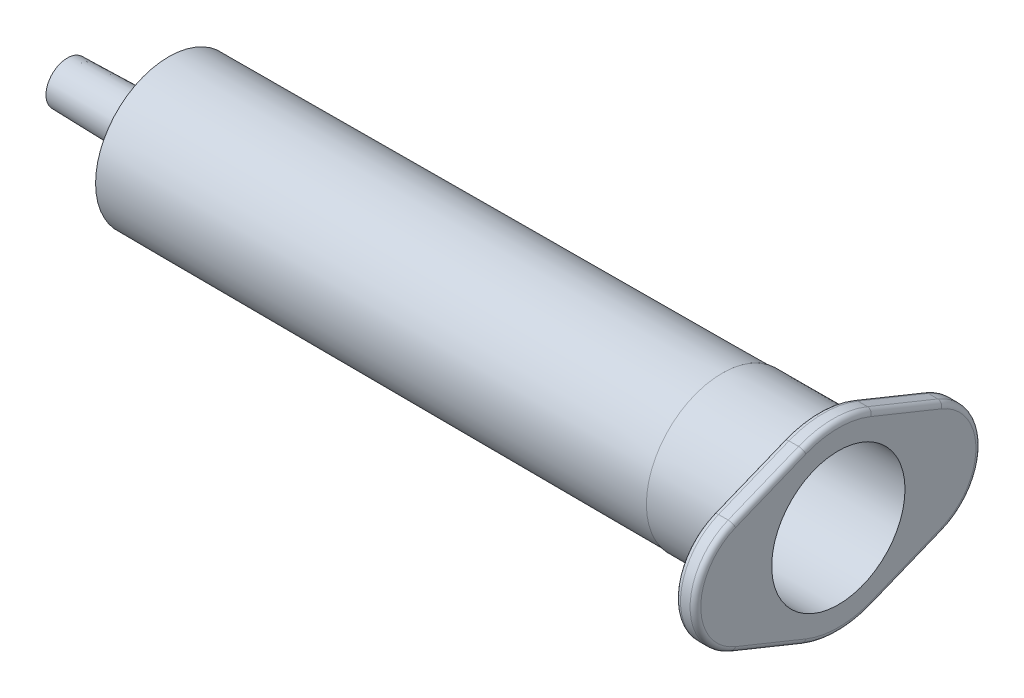
ISO-10303-21;
HEADER;
FILE_DESCRIPTION(('STEP AP214'),'2;1');
FILE_NAME('part.step','',(''),(''),'','','');
FILE_SCHEMA(('AUTOMOTIVE_DESIGN { 1 0 10303 214 1 1 1 1 }'));
ENDSEC;
DATA;
#1=APPLICATION_CONTEXT('core data for automotive mechanical design processes');
#2=APPLICATION_PROTOCOL_DEFINITION('international standard','automotive_design',2000,#1);
#3=PRODUCT_CONTEXT('',#1,'mechanical');
#4=PRODUCT('Part','Part','',(#3));
#5=PRODUCT_RELATED_PRODUCT_CATEGORY('part','',(#4));
#6=PRODUCT_DEFINITION_FORMATION('','',#4);
#7=PRODUCT_DEFINITION_CONTEXT('part definition',#1,'design');
#8=PRODUCT_DEFINITION('design','',#6,#7);
#9=PRODUCT_DEFINITION_SHAPE('','',#8);
#10=(LENGTH_UNIT() NAMED_UNIT(*) SI_UNIT(.MILLI.,.METRE.));
#11=(NAMED_UNIT(*) PLANE_ANGLE_UNIT() SI_UNIT($,.RADIAN.));
#12=(NAMED_UNIT(*) SI_UNIT($,.STERADIAN.) SOLID_ANGLE_UNIT());
#13=UNCERTAINTY_MEASURE_WITH_UNIT(LENGTH_MEASURE(1.E-05),#10,'distance_accuracy_value','');
#14=(GEOMETRIC_REPRESENTATION_CONTEXT(3) GLOBAL_UNCERTAINTY_ASSIGNED_CONTEXT((#13)) GLOBAL_UNIT_ASSIGNED_CONTEXT((#10,
#11,#12)) REPRESENTATION_CONTEXT('',''));
#15=CARTESIAN_POINT('',(0.,0.,0.));
#16=DIRECTION('',(0.,0.,1.));
#17=DIRECTION('',(1.,0.,0.));
#18=AXIS2_PLACEMENT_3D('',#15,#16,#17);
#19=CARTESIAN_POINT('',(70.4000000000012,3.20640346994704E-13,7.68880885382002));
#20=DIRECTION('',(1.,0.,0.));
#21=DIRECTION('',(0.,0.,-1.));
#22=AXIS2_PLACEMENT_3D('',#19,#20,#21);
#23=CYLINDRICAL_SURFACE('',#22,5.71119114618049);
#24=DIRECTION('',(1.,0.,0.));
#25=VECTOR('',#24,1.);
#26=CARTESIAN_POINT('',(70.4000000000012,5.29275978166862,9.83459500387454));
#27=LINE('',#26,#25);
#28=CARTESIAN_POINT('',(70.9000000000012,5.29275978166862,9.83459500387454));
#29=VERTEX_POINT('',#28);
#30=CARTESIAN_POINT('',(71.7999999999985,5.29275978166862,9.83459500387454));
#31=VERTEX_POINT('',#30);
#32=EDGE_CURVE('E156',#29,#31,#27,.T.);
#33=ORIENTED_EDGE('',*,*,#32,.F.);
#34=CARTESIAN_POINT('',(70.9000000000012,3.20640346994704E-13,7.68880885382002));
#35=DIRECTION('',(1.,0.,0.));
#36=DIRECTION('',(0.,0.,-1.));
#37=AXIS2_PLACEMENT_3D('',#34,#35,#36);
#38=CIRCLE('',#37,5.71119114618049);
#39=CARTESIAN_POINT('',(70.9000000000012,-5.29275978166786,9.83459500387445));
#40=VERTEX_POINT('',#39);
#41=EDGE_CURVE('E190',#29,#40,#38,.T.);
#42=ORIENTED_EDGE('',*,*,#41,.T.);
#43=DIRECTION('',(1.,0.,0.));
#44=VECTOR('',#43,1.);
#45=CARTESIAN_POINT('',(70.4000000000012,-5.29275978166786,9.83459500387445));
#46=LINE('',#45,#44);
#47=CARTESIAN_POINT('',(71.7999999999985,-5.29275978166786,9.83459500387445));
#48=VERTEX_POINT('',#47);
#49=EDGE_CURVE('E405',#40,#48,#46,.T.);
#50=ORIENTED_EDGE('',*,*,#49,.T.);
#51=CARTESIAN_POINT('',(71.7999999999985,3.20640346994704E-13,7.68880885382002));
#52=DIRECTION('',(1.,0.,0.));
#53=DIRECTION('',(0.,0.,-1.));
#54=AXIS2_PLACEMENT_3D('',#51,#52,#53);
#55=CIRCLE('',#54,5.71119114618049);
#56=EDGE_CURVE('E194',#48,#31,#55,.F.);
#57=ORIENTED_EDGE('',*,*,#56,.T.);
#58=EDGE_LOOP('',(#33,#42,#50,#57));
#59=FACE_BOUND('',#58,.T.);
#60=ADVANCED_FACE('F32',(#59),#23,.T.);
#61=CARTESIAN_POINT('',(70.4000000000012,9.27989288825678,6.92371507349243E-13));
#62=DIRECTION('',(0.,0.926734834502589,0.375716045065232));
#63=DIRECTION('',(0.,-0.375716045065232,0.926734834502589));
#64=AXIS2_PLACEMENT_3D('',#61,#62,#63);
#65=PLANE('',#64);
#66=DIRECTION('',(1.,0.,0.));
#67=VECTOR('',#66,1.);
#68=CARTESIAN_POINT('',(70.4000000000012,7.9699195767227,3.23115798756165));
#69=LINE('',#68,#67);
#70=CARTESIAN_POINT('',(71.7999999999985,7.9699195767227,3.23115798756165));
#71=VERTEX_POINT('',#70);
#72=CARTESIAN_POINT('',(70.9000000000012,7.9699195767227,3.23115798756165));
#73=VERTEX_POINT('',#72);
#74=EDGE_CURVE('E153',#71,#73,#69,.F.);
#75=ORIENTED_EDGE('',*,*,#74,.T.);
#76=DIRECTION('',(0.,-0.375716045065232,0.926734834502589));
#77=VECTOR('',#76,1.);
#78=CARTESIAN_POINT('',(70.9000000000012,5.29275978166861,9.83459500387454));
#79=LINE('',#78,#77);
#80=EDGE_CURVE('E161',#73,#29,#79,.T.);
#81=ORIENTED_EDGE('',*,*,#80,.T.);
#82=ORIENTED_EDGE('',*,*,#32,.T.);
#83=DIRECTION('',(0.,-0.375716045065232,0.926734834502589));
#84=VECTOR('',#83,1.);
#85=CARTESIAN_POINT('',(71.7999999999985,9.27989288825678,6.92371507349243E-13));
#86=LINE('',#85,#84);
#87=EDGE_CURVE('E149',#31,#71,#86,.F.);
#88=ORIENTED_EDGE('',*,*,#87,.T.);
#89=EDGE_LOOP('',(#75,#81,#82,#88));
#90=FACE_BOUND('',#89,.T.);
#91=ADVANCED_FACE('F151',(#90),#65,.T.);
#92=CARTESIAN_POINT('',(70.4000000000012,5.29275978166847,-9.83459500387373));
#93=DIRECTION('',(0.,0.926734834502592,-0.375716045065225));
#94=DIRECTION('',(0.,0.375716045065225,0.926734834502592));
#95=AXIS2_PLACEMENT_3D('',#92,#93,#94);
#96=PLANE('',#95);
#97=DIRECTION('',(1.,0.,0.));
#98=VECTOR('',#97,1.);
#99=CARTESIAN_POINT('',(70.4000000000012,5.29275978166847,-9.83459500387373));
#100=LINE('',#99,#98);
#101=CARTESIAN_POINT('',(70.9000000000012,5.29275978166847,-9.83459500387373));
#102=VERTEX_POINT('',#101);
#103=CARTESIAN_POINT('',(71.7999999999985,5.29275978166847,-9.83459500387373));
#104=VERTEX_POINT('',#103);
#105=EDGE_CURVE('E377',#102,#104,#100,.T.);
#106=ORIENTED_EDGE('',*,*,#105,.F.);
#107=DIRECTION('',(0.,0.375716045065225,0.926734834502592));
#108=VECTOR('',#107,1.);
#109=CARTESIAN_POINT('',(70.9000000000012,7.96991957672273,-3.23115798756028));
#110=LINE('',#109,#108);
#111=CARTESIAN_POINT('',(70.9000000000012,7.96991957672273,-3.23115798756028));
#112=VERTEX_POINT('',#111);
#113=EDGE_CURVE('E203',#102,#112,#110,.T.);
#114=ORIENTED_EDGE('',*,*,#113,.T.);
#115=DIRECTION('',(1.,0.,0.));
#116=VECTOR('',#115,1.);
#117=CARTESIAN_POINT('',(70.4000000000012,7.96991957672273,-3.23115798756028));
#118=LINE('',#117,#116);
#119=CARTESIAN_POINT('',(71.7999999999985,7.96991957672273,-3.23115798756028));
#120=VERTEX_POINT('',#119);
#121=EDGE_CURVE('E173',#112,#120,#118,.T.);
#122=ORIENTED_EDGE('',*,*,#121,.T.);
#123=DIRECTION('',(0.,0.375716045065225,0.926734834502592));
#124=VECTOR('',#123,1.);
#125=CARTESIAN_POINT('',(71.7999999999985,5.29275978166847,-9.83459500387373));
#126=LINE('',#125,#124);
#127=EDGE_CURVE('E201',#120,#104,#126,.F.);
#128=ORIENTED_EDGE('',*,*,#127,.T.);
#129=EDGE_LOOP('',(#106,#114,#122,#128));
#130=FACE_BOUND('',#129,.T.);
#131=ADVANCED_FACE('F291',(#130),#96,.T.);
#132=CARTESIAN_POINT('',(70.4000000000012,1.04245200575101E-13,-7.68880885381922));
#133=DIRECTION('',(1.,0.,0.));
#134=DIRECTION('',(0.,0.,-1.));
#135=AXIS2_PLACEMENT_3D('',#132,#133,#134);
#136=CYLINDRICAL_SURFACE('',#135,5.71119114618061);
#137=DIRECTION('',(1.,0.,0.));
#138=VECTOR('',#137,1.);
#139=CARTESIAN_POINT('',(70.4000000000012,-5.29275978166824,-9.83459500387375));
#140=LINE('',#139,#138);
#141=CARTESIAN_POINT('',(70.9000000000012,-5.29275978166824,-9.83459500387375));
#142=VERTEX_POINT('',#141);
#143=CARTESIAN_POINT('',(71.7999999999985,-5.29275978166824,-9.83459500387375));
#144=VERTEX_POINT('',#143);
#145=EDGE_CURVE('E384',#142,#144,#140,.T.);
#146=ORIENTED_EDGE('',*,*,#145,.F.);
#147=CARTESIAN_POINT('',(70.9000000000012,1.04245200575101E-13,-7.68880885381922));
#148=DIRECTION('',(1.,0.,0.));
#149=DIRECTION('',(0.,0.,-1.));
#150=AXIS2_PLACEMENT_3D('',#147,#148,#149);
#151=CIRCLE('',#150,5.71119114618061);
#152=EDGE_CURVE('E212',#142,#102,#151,.T.);
#153=ORIENTED_EDGE('',*,*,#152,.T.);
#154=ORIENTED_EDGE('',*,*,#105,.T.);
#155=CARTESIAN_POINT('',(71.7999999999985,1.04245200575101E-13,-7.68880885381922));
#156=DIRECTION('',(1.,0.,0.));
#157=DIRECTION('',(0.,0.,-1.));
#158=AXIS2_PLACEMENT_3D('',#155,#156,#157);
#159=CIRCLE('',#158,5.71119114618061);
#160=EDGE_CURVE('E209',#104,#144,#159,.F.);
#161=ORIENTED_EDGE('',*,*,#160,.T.);
#162=EDGE_LOOP('',(#146,#153,#154,#161));
#163=FACE_BOUND('',#162,.T.);
#164=ADVANCED_FACE('F381',(#163),#136,.T.);
#165=CARTESIAN_POINT('',(70.4000000000012,-9.27989288825619,-1.30104260698261E-13));
#166=DIRECTION('',(0.,-0.926734834502592,-0.375716045065223));
#167=DIRECTION('',(0.,0.375716045065223,-0.926734834502593));
#168=AXIS2_PLACEMENT_3D('',#165,#166,#167);
#169=PLANE('',#168);
#170=DIRECTION('',(1.,0.,0.));
#171=VECTOR('',#170,1.);
#172=CARTESIAN_POINT('',(70.4000000000012,-7.96991957672217,-3.23115798756104));
#173=LINE('',#172,#171);
#174=CARTESIAN_POINT('',(71.7999999999985,-7.96991957672217,-3.23115798756104));
#175=VERTEX_POINT('',#174);
#176=CARTESIAN_POINT('',(70.9000000000012,-7.96991957672217,-3.23115798756104));
#177=VERTEX_POINT('',#176);
#178=EDGE_CURVE('E392',#175,#177,#173,.F.);
#179=ORIENTED_EDGE('',*,*,#178,.T.);
#180=DIRECTION('',(0.,0.375716045065223,-0.926734834502593));
#181=VECTOR('',#180,1.);
#182=CARTESIAN_POINT('',(70.9000000000012,-5.29275978166823,-9.83459500387375));
#183=LINE('',#182,#181);
#184=EDGE_CURVE('E216',#177,#142,#183,.T.);
#185=ORIENTED_EDGE('',*,*,#184,.T.);
#186=ORIENTED_EDGE('',*,*,#145,.T.);
#187=DIRECTION('',(0.,0.375716045065223,-0.926734834502593));
#188=VECTOR('',#187,1.);
#189=CARTESIAN_POINT('',(71.7999999999985,-9.27989288825619,-1.30104260698261E-13));
#190=LINE('',#189,#188);
#191=EDGE_CURVE('E214',#144,#175,#190,.F.);
#192=ORIENTED_EDGE('',*,*,#191,.T.);
#193=EDGE_LOOP('',(#179,#185,#186,#192));
#194=FACE_BOUND('',#193,.T.);
#195=ADVANCED_FACE('F391',(#194),#169,.T.);
#196=CARTESIAN_POINT('',(70.4000000000012,-5.29275978166786,9.83459500387445));
#197=DIRECTION('',(0.,-0.926734834502593,0.375716045065221));
#198=DIRECTION('',(0.,-0.375716045065221,-0.926734834502593));
#199=AXIS2_PLACEMENT_3D('',#196,#197,#198);
#200=PLANE('',#199);
#201=ORIENTED_EDGE('',*,*,#49,.F.);
#202=DIRECTION('',(0.,-0.375716045065221,-0.926734834502593));
#203=VECTOR('',#202,1.);
#204=CARTESIAN_POINT('',(70.9000000000012,-7.96991957672218,3.23115798756078));
#205=LINE('',#204,#203);
#206=CARTESIAN_POINT('',(70.9000000000012,-7.96991957672218,3.23115798756078));
#207=VERTEX_POINT('',#206);
#208=EDGE_CURVE('E199',#40,#207,#205,.T.);
#209=ORIENTED_EDGE('',*,*,#208,.T.);
#210=DIRECTION('',(1.,0.,0.));
#211=VECTOR('',#210,1.);
#212=CARTESIAN_POINT('',(70.4000000000012,-7.96991957672218,3.23115798756078));
#213=LINE('',#212,#211);
#214=CARTESIAN_POINT('',(71.7999999999985,-7.96991957672218,3.23115798756078));
#215=VERTEX_POINT('',#214);
#216=EDGE_CURVE('E398',#207,#215,#213,.T.);
#217=ORIENTED_EDGE('',*,*,#216,.T.);
#218=DIRECTION('',(0.,-0.375716045065221,-0.926734834502593));
#219=VECTOR('',#218,1.);
#220=CARTESIAN_POINT('',(71.7999999999985,-5.29275978166786,9.83459500387445));
#221=LINE('',#220,#219);
#222=EDGE_CURVE('E192',#215,#48,#221,.F.);
#223=ORIENTED_EDGE('',*,*,#222,.T.);
#224=EDGE_LOOP('',(#201,#209,#217,#223));
#225=FACE_BOUND('',#224,.T.);
#226=ADVANCED_FACE('F295',(#225),#200,.T.);
#227=CARTESIAN_POINT('',(70.4000000000012,3.20640346994704E-13,7.68880885382002));
#228=DIRECTION('',(1.,0.,0.));
#229=DIRECTION('',(0.,0.,-1.));
#230=AXIS2_PLACEMENT_3D('',#227,#228,#229);
#231=PLANE('',#230);
#232=CARTESIAN_POINT('',(70.4000000000012,3.20640346994704E-13,7.68880885382002));
#233=DIRECTION('',(1.,0.,0.));
#234=DIRECTION('',(0.,0.,-1.));
#235=AXIS2_PLACEMENT_3D('',#232,#233,#234);
#236=CIRCLE('',#235,5.21119114618049);
#237=CARTESIAN_POINT('',(70.4000000000012,-4.82939236441657,9.64673698134184));
#238=VERTEX_POINT('',#237);
#239=CARTESIAN_POINT('',(70.4000000000012,4.82939236441726,9.6467369813419));
#240=VERTEX_POINT('',#239);
#241=EDGE_CURVE('E437',#238,#240,#236,.F.);
#242=ORIENTED_EDGE('',*,*,#241,.T.);
#243=DIRECTION('',(0.,-0.375716045065232,0.926734834502589));
#244=VECTOR('',#243,1.);
#245=CARTESIAN_POINT('',(70.4000000000012,7.50655215947141,3.04329996502904));
#246=LINE('',#245,#244);
#247=CARTESIAN_POINT('',(70.4000000000012,7.50655215947141,3.04329996502904));
#248=VERTEX_POINT('',#247);
#249=EDGE_CURVE('E439',#240,#248,#246,.F.);
#250=ORIENTED_EDGE('',*,*,#249,.T.);
#251=CARTESIAN_POINT('',(70.4000000000012,4.34981911601184E-13,6.55725473919233E-13));
#252=DIRECTION('',(1.,0.,0.));
#253=DIRECTION('',(0.,0.,-1.));
#254=AXIS2_PLACEMENT_3D('',#251,#252,#253);
#255=CIRCLE('',#254,8.1);
#256=CARTESIAN_POINT('',(70.4000000000012,7.50655215947143,-3.04329996502767));
#257=VERTEX_POINT('',#256);
#258=EDGE_CURVE('E435',#248,#257,#255,.F.);
#259=ORIENTED_EDGE('',*,*,#258,.T.);
#260=DIRECTION('',(0.,0.375716045065225,0.926734834502592));
#261=VECTOR('',#260,1.);
#262=CARTESIAN_POINT('',(70.4000000000012,4.82939236441717,-9.64673698134111));
#263=LINE('',#262,#261);
#264=CARTESIAN_POINT('',(70.4000000000012,4.82939236441717,-9.64673698134111));
#265=VERTEX_POINT('',#264);
#266=EDGE_CURVE('E431',#257,#265,#263,.F.);
#267=ORIENTED_EDGE('',*,*,#266,.T.);
#268=CARTESIAN_POINT('',(70.4000000000012,1.04245200575101E-13,-7.68880885381922));
#269=DIRECTION('',(1.,0.,0.));
#270=DIRECTION('',(0.,0.,-1.));
#271=AXIS2_PLACEMENT_3D('',#268,#269,#270);
#272=CIRCLE('',#271,5.21119114618061);
#273=CARTESIAN_POINT('',(70.4000000000012,-4.82939236441694,-9.64673698134114));
#274=VERTEX_POINT('',#273);
#275=EDGE_CURVE('E427',#265,#274,#272,.F.);
#276=ORIENTED_EDGE('',*,*,#275,.T.);
#277=DIRECTION('',(0.,0.375716045065223,-0.926734834502593));
#278=VECTOR('',#277,1.);
#279=CARTESIAN_POINT('',(70.4000000000012,-7.50655215947087,-3.04329996502843));
#280=LINE('',#279,#278);
#281=CARTESIAN_POINT('',(70.4000000000012,-7.50655215947087,-3.04329996502843));
#282=VERTEX_POINT('',#281);
#283=EDGE_CURVE('E425',#274,#282,#280,.F.);
#284=ORIENTED_EDGE('',*,*,#283,.T.);
#285=CARTESIAN_POINT('',(70.4000000000012,1.27502175484295E-13,-1.24032728532342E-13));
#286=DIRECTION('',(1.,0.,0.));
#287=DIRECTION('',(0.,0.,-1.));
#288=AXIS2_PLACEMENT_3D('',#285,#286,#287);
#289=CIRCLE('',#288,8.1);
#290=CARTESIAN_POINT('',(70.4000000000012,-7.50655215947088,3.04329996502817));
#291=VERTEX_POINT('',#290);
#292=EDGE_CURVE('E429',#282,#291,#289,.F.);
#293=ORIENTED_EDGE('',*,*,#292,.T.);
#294=DIRECTION('',(0.,-0.375716045065221,-0.926734834502593));
#295=VECTOR('',#294,1.);
#296=CARTESIAN_POINT('',(70.4000000000012,-4.82939236441656,9.64673698134184));
#297=LINE('',#296,#295);
#298=EDGE_CURVE('E433',#291,#238,#297,.F.);
#299=ORIENTED_EDGE('',*,*,#298,.T.);
#300=EDGE_LOOP('',(#242,#250,#259,#267,#276,#284,#293,#299));
#301=FACE_BOUND('',#300,.T.);
#302=CARTESIAN_POINT('',(70.4000000000012,3.67754273184448E-13,0.));
#303=DIRECTION('',(1.,0.,0.));
#304=DIRECTION('',(0.,0.,-1.));
#305=AXIS2_PLACEMENT_3D('',#302,#303,#304);
#306=CIRCLE('',#305,7.62967376398338);
#307=CARTESIAN_POINT('',(70.4000000000012,3.67754273184448E-13,-7.62967376398329));
#308=VERTEX_POINT('',#307);
#309=EDGE_CURVE('E422',#308,#308,#306,.T.);
#310=ORIENTED_EDGE('',*,*,#309,.T.);
#311=EDGE_LOOP('',(#310));
#312=FACE_BOUND('',#311,.T.);
#313=ADVANCED_FACE('F443',(#301,#312),#231,.F.);
#314=CARTESIAN_POINT('',(72.2999999999985,3.20640346994704E-13,7.68880885382002));
#315=DIRECTION('',(1.,0.,0.));
#316=DIRECTION('',(0.,0.,-1.));
#317=AXIS2_PLACEMENT_3D('',#314,#315,#316);
#318=PLANE('',#317);
#319=DIRECTION('',(0.,0.375716045065223,-0.926734834502593));
#320=VECTOR('',#319,1.);
#321=CARTESIAN_POINT('',(72.2999999999985,-10.1837119545251,3.56013705128508));
#322=LINE('',#321,#320);
#323=CARTESIAN_POINT('',(72.2999999999985,-7.50655215947088,-3.04329996502843));
#324=VERTEX_POINT('',#323);
#325=CARTESIAN_POINT('',(72.2999999999985,-4.82939236441694,-9.64673698134114));
#326=VERTEX_POINT('',#325);
#327=EDGE_CURVE('E55',#324,#326,#322,.T.);
#328=ORIENTED_EDGE('',*,*,#327,.T.);
#329=CARTESIAN_POINT('',(72.2999999999985,1.04245200575101E-13,-7.68880885381922));
#330=DIRECTION('',(1.,0.,0.));
#331=DIRECTION('',(0.,0.,-1.));
#332=AXIS2_PLACEMENT_3D('',#329,#330,#331);
#333=CIRCLE('',#332,5.21119114618061);
#334=CARTESIAN_POINT('',(72.2999999999985,4.82939236441717,-9.64673698134111));
#335=VERTEX_POINT('',#334);
#336=EDGE_CURVE('E230',#326,#335,#333,.T.);
#337=ORIENTED_EDGE('',*,*,#336,.T.);
#338=DIRECTION('',(0.,0.375716045065225,0.926734834502592));
#339=VECTOR('',#338,1.);
#340=CARTESIAN_POINT('',(72.2999999999985,10.1837119545254,3.56013705128519));
#341=LINE('',#340,#339);
#342=CARTESIAN_POINT('',(72.2999999999985,7.50655215947143,-3.04329996502767));
#343=VERTEX_POINT('',#342);
#344=EDGE_CURVE('E228',#335,#343,#341,.T.);
#345=ORIENTED_EDGE('',*,*,#344,.T.);
#346=CARTESIAN_POINT('',(72.2999999999985,4.34981911601184E-13,6.55725473919233E-13));
#347=DIRECTION('',(1.,0.,0.));
#348=DIRECTION('',(0.,0.,-1.));
#349=AXIS2_PLACEMENT_3D('',#346,#347,#348);
#350=CIRCLE('',#349,8.1);
#351=CARTESIAN_POINT('',(72.2999999999985,7.50655215947141,3.04329996502904));
#352=VERTEX_POINT('',#351);
#353=EDGE_CURVE('E225',#343,#352,#350,.T.);
#354=ORIENTED_EDGE('',*,*,#353,.T.);
#355=DIRECTION('',(0.,-0.375716045065232,0.926734834502589));
#356=VECTOR('',#355,1.);
#357=CARTESIAN_POINT('',(72.2999999999985,4.82939236441732,9.64673698134193));
#358=LINE('',#357,#356);
#359=CARTESIAN_POINT('',(72.2999999999985,4.82939236441726,9.6467369813419));
#360=VERTEX_POINT('',#359);
#361=EDGE_CURVE('E179',#352,#360,#358,.T.);
#362=ORIENTED_EDGE('',*,*,#361,.T.);
#363=CARTESIAN_POINT('',(72.2999999999985,3.20640346994704E-13,7.68880885382002));
#364=DIRECTION('',(1.,0.,0.));
#365=DIRECTION('',(0.,0.,-1.));
#366=AXIS2_PLACEMENT_3D('',#363,#364,#365);
#367=CIRCLE('',#366,5.21119114618049);
#368=CARTESIAN_POINT('',(72.2999999999985,-4.82939236441663,9.64673698134187));
#369=VERTEX_POINT('',#368);
#370=EDGE_CURVE('E218',#360,#369,#367,.T.);
#371=ORIENTED_EDGE('',*,*,#370,.T.);
#372=DIRECTION('',(0.,-0.375716045065221,-0.926734834502593));
#373=VECTOR('',#372,1.);
#374=CARTESIAN_POINT('',(72.2999999999985,-4.82939236441657,9.64673698134182));
#375=LINE('',#374,#373);
#376=CARTESIAN_POINT('',(72.2999999999985,-7.50655215947088,3.04329996502817));
#377=VERTEX_POINT('',#376);
#378=EDGE_CURVE('E220',#369,#377,#375,.T.);
#379=ORIENTED_EDGE('',*,*,#378,.T.);
#380=CARTESIAN_POINT('',(72.2999999999985,1.27502175484295E-13,-1.24032728532342E-13));
#381=DIRECTION('',(1.,0.,0.));
#382=DIRECTION('',(0.,0.,-1.));
#383=AXIS2_PLACEMENT_3D('',#380,#381,#382);
#384=CIRCLE('',#383,8.1);
#385=EDGE_CURVE('E223',#377,#324,#384,.T.);
#386=ORIENTED_EDGE('',*,*,#385,.T.);
#387=EDGE_LOOP('',(#328,#337,#345,#354,#362,#371,#379,#386));
#388=FACE_BOUND('',#387,.T.);
#389=CARTESIAN_POINT('',(72.2999999999985,0.,1.25564390031332E-13));
#390=DIRECTION('',(1.,0.,0.));
#391=DIRECTION('',(0.,0.,-1.));
#392=AXIS2_PLACEMENT_3D('',#389,#390,#391);
#393=CIRCLE('',#392,6.25000000000037);
#394=CARTESIAN_POINT('',(72.2999999999985,0.,-6.25000000000024));
#395=VERTEX_POINT('',#394);
#396=EDGE_CURVE('E258',#395,#395,#393,.T.);
#397=ORIENTED_EDGE('',*,*,#396,.F.);
#398=EDGE_LOOP('',(#397));
#399=FACE_BOUND('',#398,.T.);
#400=ADVANCED_FACE('F371',(#388,#399),#318,.T.);
#401=CARTESIAN_POINT('',(61.4000000000012,3.67754273184448E-13,1.06634212281108E-13));
#402=DIRECTION('',(1.,0.,0.));
#403=DIRECTION('',(0.,0.,-1.));
#404=AXIS2_PLACEMENT_3D('',#401,#402,#403);
#405=CONICAL_SURFACE('',#404,7.10000000000007,0.00349065850399727);
#406=CARTESIAN_POINT('',(69.9017453257094,3.67754273184448E-13,1.21399308629992E-13));
#407=DIRECTION('',(-1.,0.,0.));
#408=DIRECTION('',(0.,0.,1.));
#409=AXIS2_PLACEMENT_3D('',#406,#407,#408);
#410=CIRCLE('',#409,7.12967681015448);
#411=CARTESIAN_POINT('',(69.9017453257094,3.67754273184448E-13,7.12967681015461));
#412=VERTEX_POINT('',#411);
#413=EDGE_CURVE('E232',#412,#412,#410,.T.);
#414=ORIENTED_EDGE('',*,*,#413,.T.);
#415=EDGE_LOOP('',(#414));
#416=FACE_BOUND('',#415,.T.);
#417=CARTESIAN_POINT('',(61.4000000000012,3.67754273184448E-13,1.06634212281108E-13));
#418=DIRECTION('',(-1.,0.,0.));
#419=DIRECTION('',(0.,0.,1.));
#420=AXIS2_PLACEMENT_3D('',#417,#418,#419);
#421=CIRCLE('',#420,7.10000000000007);
#422=CARTESIAN_POINT('',(61.4000000000012,3.67754273184448E-13,7.10000000000018));
#423=VERTEX_POINT('',#422);
#424=EDGE_CURVE('E408',#423,#423,#421,.T.);
#425=ORIENTED_EDGE('',*,*,#424,.F.);
#426=EDGE_LOOP('',(#425));
#427=FACE_BOUND('',#426,.T.);
#428=ADVANCED_FACE('F471',(#416,#427),#405,.T.);
#429=CARTESIAN_POINT('',(61.4000000000011,7.0311659121752,1.06634212281108E-13));
#430=DIRECTION('',(-1.,0.,0.));
#431=DIRECTION('',(0.,0.,1.));
#432=AXIS2_PLACEMENT_3D('',#429,#430,#431);
#433=PLANE('',#432);
#434=ORIENTED_EDGE('',*,*,#424,.T.);
#435=EDGE_LOOP('',(#434));
#436=FACE_BOUND('',#435,.T.);
#437=CARTESIAN_POINT('',(61.400000000001,3.67754273184448E-13,1.06634212281108E-13));
#438=DIRECTION('',(-1.,0.,0.));
#439=DIRECTION('',(0.,0.,1.));
#440=AXIS2_PLACEMENT_3D('',#437,#438,#439);
#441=CIRCLE('',#440,7.03116591217483);
#442=CARTESIAN_POINT('',(61.400000000001,3.67754273184448E-13,7.03116591217494));
#443=VERTEX_POINT('',#442);
#444=EDGE_CURVE('E412',#443,#443,#441,.T.);
#445=ORIENTED_EDGE('',*,*,#444,.F.);
#446=EDGE_LOOP('',(#445));
#447=FACE_BOUND('',#446,.T.);
#448=ADVANCED_FACE('F477',(#436,#447),#433,.T.);
#449=CARTESIAN_POINT('',(9.4999999999974,3.67754273184448E-13,0.));
#450=DIRECTION('',(1.,0.,0.));
#451=DIRECTION('',(0.,0.,-1.));
#452=AXIS2_PLACEMENT_3D('',#449,#450,#451);
#453=CONICAL_SURFACE('',#452,6.84999999999993,0.00349065850398954);
#454=ORIENTED_EDGE('',*,*,#444,.T.);
#455=EDGE_LOOP('',(#454));
#456=FACE_BOUND('',#455,.T.);
#457=CARTESIAN_POINT('',(9.4999999999974,3.67754273184448E-13,0.));
#458=DIRECTION('',(-1.,0.,0.));
#459=DIRECTION('',(0.,0.,1.));
#460=AXIS2_PLACEMENT_3D('',#457,#458,#459);
#461=CIRCLE('',#460,6.84999999999993);
#462=CARTESIAN_POINT('',(9.49999999999739,3.67754273184448E-13,6.84999999999994));
#463=VERTEX_POINT('',#462);
#464=EDGE_CURVE('E455',#463,#463,#461,.T.);
#465=ORIENTED_EDGE('',*,*,#464,.F.);
#466=EDGE_LOOP('',(#465));
#467=FACE_BOUND('',#466,.T.);
#468=ADVANCED_FACE('F633',(#456,#467),#453,.T.);
#469=CARTESIAN_POINT('',(8.50000000000181,3.67754273184448E-13,0.));
#470=DIRECTION('',(1.,0.,0.));
#471=DIRECTION('',(0.,0.,-1.));
#472=AXIS2_PLACEMENT_3D('',#469,#470,#471);
#473=CONICAL_SURFACE('',#472,2.19999999999988,1.35896877931439);
#474=CARTESIAN_POINT('',(8.66579081728504,3.67754273184448E-13,0.));
#475=DIRECTION('',(1.,0.,0.));
#476=DIRECTION('',(0.,0.,-1.));
#477=AXIS2_PLACEMENT_3D('',#474,#475,#476);
#478=CIRCLE('',#477,2.97092730037031);
#479=CARTESIAN_POINT('',(8.66579081728504,3.67754273184448E-13,-2.97092730037029));
#480=VERTEX_POINT('',#479);
#481=EDGE_CURVE('E11',#480,#480,#478,.T.);
#482=ORIENTED_EDGE('',*,*,#481,.T.);
#483=EDGE_LOOP('',(#482));
#484=FACE_BOUND('',#483,.T.);
#485=ORIENTED_EDGE('',*,*,#464,.T.);
#486=EDGE_LOOP('',(#485));
#487=FACE_BOUND('',#486,.T.);
#488=ADVANCED_FACE('F628',(#484,#487),#473,.T.);
#489=CARTESIAN_POINT('',(0.,3.67754273184448E-13,0.));
#490=DIRECTION('',(1.,0.,0.));
#491=DIRECTION('',(0.,0.,-1.));
#492=AXIS2_PLACEMENT_3D('',#489,#490,#491);
#493=CONICAL_SURFACE('',#492,1.99999999999965,0.0235250709852388);
#494=CARTESIAN_POINT('',(7.71166540712642,3.67754273184448E-13,0.));
#495=DIRECTION('',(1.,0.,0.));
#496=DIRECTION('',(0.,0.,-1.));
#497=AXIS2_PLACEMENT_3D('',#494,#495,#496);
#498=CIRCLE('',#497,2.18145095075574);
#499=CARTESIAN_POINT('',(7.71166540712642,3.67754273184448E-13,-2.18145095075572));
#500=VERTEX_POINT('',#499);
#501=EDGE_CURVE('E40',#500,#500,#498,.F.);
#502=ORIENTED_EDGE('',*,*,#501,.T.);
#503=EDGE_LOOP('',(#502));
#504=FACE_BOUND('',#503,.T.);
#505=CARTESIAN_POINT('',(0.,3.67754273184448E-13,0.));
#506=DIRECTION('',(-1.,0.,0.));
#507=DIRECTION('',(0.,0.,1.));
#508=AXIS2_PLACEMENT_3D('',#505,#506,#507);
#509=CIRCLE('',#508,1.99999999999965);
#510=CARTESIAN_POINT('',(0.,3.67754273184448E-13,1.99999999999965));
#511=VERTEX_POINT('',#510);
#512=EDGE_CURVE('E458',#511,#511,#509,.T.);
#513=ORIENTED_EDGE('',*,*,#512,.F.);
#514=EDGE_LOOP('',(#513));
#515=FACE_BOUND('',#514,.T.);
#516=ADVANCED_FACE('F273',(#504,#515),#493,.T.);
#517=CARTESIAN_POINT('',(0.,3.67754273184448E-13,0.));
#518=DIRECTION('',(-1.,0.,0.));
#519=DIRECTION('',(0.,0.,1.));
#520=AXIS2_PLACEMENT_3D('',#517,#518,#519);
#521=PLANE('',#520);
#522=CARTESIAN_POINT('',(0.,0.,1.25564390031332E-13));
#523=DIRECTION('',(1.,0.,0.));
#524=DIRECTION('',(0.,0.,-1.));
#525=AXIS2_PLACEMENT_3D('',#522,#523,#524);
#526=CIRCLE('',#525,1.00000000000001);
#527=CARTESIAN_POINT('',(0.,0.,-0.999999999999889));
#528=VERTEX_POINT('',#527);
#529=EDGE_CURVE('E461',#528,#528,#526,.T.);
#530=ORIENTED_EDGE('',*,*,#529,.T.);
#531=EDGE_LOOP('',(#530));
#532=FACE_BOUND('',#531,.T.);
#533=ORIENTED_EDGE('',*,*,#512,.T.);
#534=EDGE_LOOP('',(#533));
#535=FACE_BOUND('',#534,.T.);
#536=ADVANCED_FACE('F644',(#532,#535),#521,.T.);
#537=CARTESIAN_POINT('',(72.2999999999985,0.,1.25564390031332E-13));
#538=DIRECTION('',(1.,0.,0.));
#539=DIRECTION('',(0.,0.,-1.));
#540=AXIS2_PLACEMENT_3D('',#537,#538,#539);
#541=CYLINDRICAL_SURFACE('',#540,1.00000000000002);
#542=CARTESIAN_POINT('',(8.85827341460052,0.,1.25564390031332E-13));
#543=DIRECTION('',(-1.,0.,0.));
#544=DIRECTION('',(0.,0.,1.));
#545=AXIS2_PLACEMENT_3D('',#542,#543,#544);
#546=CIRCLE('',#545,1.00000000000002);
#547=CARTESIAN_POINT('',(8.85827341460052,0.,1.00000000000014));
#548=VERTEX_POINT('',#547);
#549=EDGE_CURVE('E172',#548,#548,#546,.F.);
#550=ORIENTED_EDGE('',*,*,#549,.T.);
#551=EDGE_LOOP('',(#550));
#552=FACE_BOUND('',#551,.T.);
#553=ORIENTED_EDGE('',*,*,#529,.F.);
#554=EDGE_LOOP('',(#553));
#555=FACE_BOUND('',#554,.T.);
#556=ADVANCED_FACE('F657',(#552,#555),#541,.F.);
#557=CARTESIAN_POINT('',(10.1892579090191,0.,1.25564390031332E-13));
#558=DIRECTION('',(1.,0.,0.));
#559=DIRECTION('',(0.,0.,-1.));
#560=AXIS2_PLACEMENT_3D('',#557,#558,#559);
#561=CONICAL_SURFACE('',#560,6.25000000000036,1.35896877931348);
#562=CARTESIAN_POINT('',(9.10268549242413,0.,1.25564390031332E-13));
#563=DIRECTION('',(-1.,0.,0.));
#564=DIRECTION('',(0.,0.,1.));
#565=AXIS2_PLACEMENT_3D('',#562,#563,#564);
#566=CIRCLE('',#565,1.19743826283365);
#567=CARTESIAN_POINT('',(9.10268549242413,0.,-1.19743826283353));
#568=VERTEX_POINT('',#567);
#569=EDGE_CURVE('E162',#568,#568,#566,.T.);
#570=CARTESIAN_POINT('',(10.1892579090191,0.,1.25564390031332E-13));
#571=DIRECTION('',(1.,0.,0.));
#572=DIRECTION('',(0.,0.,-1.));
#573=AXIS2_PLACEMENT_3D('',#570,#571,#572);
#574=CIRCLE('',#573,6.25000000000036);
#575=CARTESIAN_POINT('',(10.1892579090191,0.,-6.25000000000023));
#576=VERTEX_POINT('',#575);
#577=EDGE_CURVE('E464',#576,#576,#574,.T.);
#578=CARTESIAN_POINT('',(9.10268549242413,0.,-1.19743826283353));
#579=CARTESIAN_POINT('',(9.114003955097,0.,-1.25006911426235));
#580=CARTESIAN_POINT('',(9.12532241776986,0.,-1.30269996569117));
#581=CARTESIAN_POINT('',(9.14795934311559,0.,-1.40796166854881));
#582=CARTESIAN_POINT('',(9.15927780578845,0.,-1.46059251997763));
#583=CARTESIAN_POINT('',(9.18191473113418,0.,-1.56585422283527));
#584=CARTESIAN_POINT('',(9.19323319380705,0.,-1.61848507426409));
#585=CARTESIAN_POINT('',(9.21587011915278,0.,-1.72374677712173));
#586=CARTESIAN_POINT('',(9.22718858182564,0.,-1.77637762855055));
#587=CARTESIAN_POINT('',(9.24982550717137,0.,-1.88163933140819));
#588=CARTESIAN_POINT('',(9.26114396984423,0.,-1.93427018283701));
#589=CARTESIAN_POINT('',(9.28378089518996,0.,-2.03953188569465));
#590=CARTESIAN_POINT('',(9.29509935786283,0.,-2.09216273712347));
#591=CARTESIAN_POINT('',(9.31773628320856,0.,-2.19742443998111));
#592=CARTESIAN_POINT('',(9.32905474588142,0.,-2.25005529140993));
#593=CARTESIAN_POINT('',(9.35169167122715,0.,-2.35531699426756));
#594=CARTESIAN_POINT('',(9.36301013390002,0.,-2.40794784569638));
#595=CARTESIAN_POINT('',(9.38564705924575,0.,-2.51320954855402));
#596=CARTESIAN_POINT('',(9.39696552191861,0.,-2.56584039998284));
#597=CARTESIAN_POINT('',(9.41960244726434,0.,-2.67110210284048));
#598=CARTESIAN_POINT('',(9.4309209099372,0.,-2.7237329542693));
#599=CARTESIAN_POINT('',(9.45355783528293,0.,-2.82899465712694));
#600=CARTESIAN_POINT('',(9.4648762979558,0.,-2.88162550855576));
#601=CARTESIAN_POINT('',(9.48751322330153,0.,-2.9868872114134));
#602=CARTESIAN_POINT('',(9.49883168597439,0.,-3.03951806284222));
#603=CARTESIAN_POINT('',(9.52146861132012,0.,-3.14477976569986));
#604=CARTESIAN_POINT('',(9.53278707399298,0.,-3.19741061712868));
#605=CARTESIAN_POINT('',(9.55542399933871,0.,-3.30267231998632));
#606=CARTESIAN_POINT('',(9.56674246201158,0.,-3.35530317141514));
#607=CARTESIAN_POINT('',(9.58937938735731,0.,-3.46056487427278));
#608=CARTESIAN_POINT('',(9.60069785003017,0.,-3.5131957257016));
#609=CARTESIAN_POINT('',(9.6233347753759,0.,-3.61845742855924));
#610=CARTESIAN_POINT('',(9.63465323804876,0.,-3.67108827998806));
#611=CARTESIAN_POINT('',(9.65729016339449,0.,-3.7763499828457));
#612=CARTESIAN_POINT('',(9.66860862606736,0.,-3.82898083427452));
#613=CARTESIAN_POINT('',(9.69124555141309,0.,-3.93424253713216));
#614=CARTESIAN_POINT('',(9.70256401408595,0.,-3.98687338856098));
#615=CARTESIAN_POINT('',(9.72520093943168,0.,-4.09213509141862));
#616=CARTESIAN_POINT('',(9.73651940210455,0.,-4.14476594284744));
#617=CARTESIAN_POINT('',(9.75915632745028,0.,-4.25002764570508));
#618=CARTESIAN_POINT('',(9.77047479012314,0.,-4.3026584971339));
#619=CARTESIAN_POINT('',(9.79311171546887,0.,-4.40792019999154));
#620=CARTESIAN_POINT('',(9.80443017814173,0.,-4.46055105142036));
#621=CARTESIAN_POINT('',(9.82706710348746,0.,-4.56581275427799));
#622=CARTESIAN_POINT('',(9.83838556616033,0.,-4.61844360570682));
#623=CARTESIAN_POINT('',(9.86102249150606,0.,-4.72370530856445));
#624=CARTESIAN_POINT('',(9.87234095417892,0.,-4.77633615999327));
#625=CARTESIAN_POINT('',(9.89497787952465,0.,-4.88159786285091));
#626=CARTESIAN_POINT('',(9.90629634219752,0.,-4.93422871427973));
#627=CARTESIAN_POINT('',(9.92893326754325,0.,-5.03949041713737));
#628=CARTESIAN_POINT('',(9.94025173021611,0.,-5.09212126856619));
#629=CARTESIAN_POINT('',(9.96288865556184,0.,-5.19738297142383));
#630=CARTESIAN_POINT('',(9.9742071182347,0.,-5.25001382285265));
#631=CARTESIAN_POINT('',(9.99684404358043,0.,-5.35527552571029));
#632=CARTESIAN_POINT('',(10.0081625062533,0.,-5.40790637713911));
#633=CARTESIAN_POINT('',(10.030799431599,0.,-5.51316807999675));
#634=CARTESIAN_POINT('',(10.0421178942719,0.,-5.56579893142557));
#635=CARTESIAN_POINT('',(10.0647548196176,0.,-5.67106063428321));
#636=CARTESIAN_POINT('',(10.0760732822905,0.,-5.72369148571203));
#637=CARTESIAN_POINT('',(10.0987102076362,0.,-5.82895318856967));
#638=CARTESIAN_POINT('',(10.1100286703091,0.,-5.88158403999849));
#639=CARTESIAN_POINT('',(10.1326655956548,0.,-5.98684574285613));
#640=CARTESIAN_POINT('',(10.1439840583277,0.,-6.03947659428495));
#641=CARTESIAN_POINT('',(10.1666209836734,0.,-6.14473829714259));
#642=CARTESIAN_POINT('',(10.1779394463463,0.,-6.19736914857141));
#643=CARTESIAN_POINT('',(10.1892579090191,0.,-6.25000000000023));
#644=B_SPLINE_CURVE_WITH_KNOTS('',3,(#578,#579,#580,#581,#582,#583,#584,#585,#586,#587,#588,
#589,#590,#591,#592,#593,#594,#595,#596,#597,#598,#599,#600,#601,#602,#603,#604,#605,#606,#607,
#608,#609,#610,#611,#612,#613,#614,#615,#616,#617,#618,#619,#620,#621,#622,#623,#624,#625,#626,
#627,#628,#629,#630,#631,#632,#633,#634,#635,#636,#637,#638,#639,#640,#641,#642,#643),
.UNSPECIFIED.,.F.,.F.,(4,2,2,2,2,2,2,2,2,2,2,2,2,2,2,2,2,2,2,2,2,2,2,2,2,2,2,2,2,2,2,2,4),(0.,
0.161502405785783,0.323004811571566,0.484507217357348,0.646009623143132,0.807512028928915,
0.969014434714699,1.13051684050048,1.29201924628626,1.45352165207205,1.61502405785783,
1.77652646364361,1.9380288694294,2.09953127521518,2.26103368100096,2.42253608678675,
2.58403849257253,2.74554089835831,2.9070433041441,3.06854570992988,3.23004811571566,
3.39155052150144,3.55305292728723,3.71455533307301,3.87605773885879,4.03756014464458,
4.19906255043036,4.36056495621614,4.52206736200193,4.68356976778771,4.84507217357349,
5.00657457935928,5.16807698514506),.UNSPECIFIED.);
#645=EDGE_CURVE('BSEAM666',#568,#576,#644,.T.);
#646=ORIENTED_EDGE('',*,*,#569,.T.);
#647=ORIENTED_EDGE('',*,*,#577,.T.);
#648=ORIENTED_EDGE('',*,*,#645,.T.);
#649=ORIENTED_EDGE('',*,*,#645,.F.);
#650=EDGE_LOOP('',(#646,#648,#647,#649));
#651=FACE_BOUND('',#650,.T.);
#652=ADVANCED_FACE('F666',(#651),#561,.F.);
#653=CARTESIAN_POINT('',(72.2999999999985,0.,1.25564390031332E-13));
#654=DIRECTION('',(1.,0.,0.));
#655=DIRECTION('',(0.,0.,-1.));
#656=AXIS2_PLACEMENT_3D('',#653,#654,#655);
#657=CYLINDRICAL_SURFACE('',#656,6.25000000000036);
#658=ORIENTED_EDGE('',*,*,#577,.F.);
#659=EDGE_LOOP('',(#658));
#660=FACE_BOUND('',#659,.T.);
#661=ORIENTED_EDGE('',*,*,#396,.T.);
#662=EDGE_LOOP('',(#661));
#663=FACE_BOUND('',#662,.T.);
#664=ADVANCED_FACE('F300',(#660,#663),#657,.F.);
#665=CARTESIAN_POINT('',(70.4000000000012,1.27502175484295E-13,-1.24032728532342E-13));
#666=DIRECTION('',(1.,0.,0.));
#667=DIRECTION('',(0.,0.,-1.));
#668=AXIS2_PLACEMENT_3D('',#665,#666,#667);
#669=CYLINDRICAL_SURFACE('',#668,8.6);
#670=ORIENTED_EDGE('',*,*,#216,.F.);
#671=CARTESIAN_POINT('',(70.9000000000012,1.27502175484295E-13,-1.24032728532342E-13));
#672=DIRECTION('',(1.,0.,0.));
#673=DIRECTION('',(0.,0.,-1.));
#674=AXIS2_PLACEMENT_3D('',#671,#672,#673);
#675=CIRCLE('',#674,8.6);
#676=EDGE_CURVE('E207',#207,#177,#675,.T.);
#677=ORIENTED_EDGE('',*,*,#676,.T.);
#678=ORIENTED_EDGE('',*,*,#178,.F.);
#679=CARTESIAN_POINT('',(71.7999999999985,1.27502175484295E-13,-1.24032728532342E-13));
#680=DIRECTION('',(1.,0.,0.));
#681=DIRECTION('',(0.,0.,-1.));
#682=AXIS2_PLACEMENT_3D('',#679,#680,#681);
#683=CIRCLE('',#682,8.6);
#684=EDGE_CURVE('E205',#175,#215,#683,.F.);
#685=ORIENTED_EDGE('',*,*,#684,.T.);
#686=EDGE_LOOP('',(#670,#677,#678,#685));
#687=FACE_BOUND('',#686,.T.);
#688=ADVANCED_FACE('F297',(#687),#669,.T.);
#689=CARTESIAN_POINT('',(70.4000000000012,4.34981911601184E-13,6.55725473919233E-13));
#690=DIRECTION('',(1.,0.,0.));
#691=DIRECTION('',(0.,0.,-1.));
#692=AXIS2_PLACEMENT_3D('',#689,#690,#691);
#693=CYLINDRICAL_SURFACE('',#692,8.6);
#694=ORIENTED_EDGE('',*,*,#121,.F.);
#695=CARTESIAN_POINT('',(70.9000000000012,4.34981911601184E-13,6.55725473919233E-13));
#696=DIRECTION('',(1.,0.,0.));
#697=DIRECTION('',(0.,0.,-1.));
#698=AXIS2_PLACEMENT_3D('',#695,#696,#697);
#699=CIRCLE('',#698,8.6);
#700=EDGE_CURVE('E171',#112,#73,#699,.T.);
#701=ORIENTED_EDGE('',*,*,#700,.T.);
#702=ORIENTED_EDGE('',*,*,#74,.F.);
#703=CARTESIAN_POINT('',(71.7999999999985,4.34981911601184E-13,6.55725473919233E-13));
#704=DIRECTION('',(1.,0.,0.));
#705=DIRECTION('',(0.,0.,-1.));
#706=AXIS2_PLACEMENT_3D('',#703,#704,#705);
#707=CIRCLE('',#706,8.6);
#708=EDGE_CURVE('E168',#71,#120,#707,.F.);
#709=ORIENTED_EDGE('',*,*,#708,.T.);
#710=EDGE_LOOP('',(#694,#701,#702,#709));
#711=FACE_BOUND('',#710,.T.);
#712=ADVANCED_FACE('F166',(#711),#693,.T.);
#713=CARTESIAN_POINT('',(8.85827341460052,0.,1.25564390031332E-13));
#714=DIRECTION('',(-1.,0.,0.));
#715=DIRECTION('',(0.,0.,1.));
#716=AXIS2_PLACEMENT_3D('',#713,#714,#715);
#717=TOROIDAL_SURFACE('',#716,1.25000000000002,0.25);
#718=ORIENTED_EDGE('',*,*,#569,.F.);
#719=EDGE_LOOP('',(#718));
#720=FACE_BOUND('',#719,.T.);
#721=ORIENTED_EDGE('',*,*,#549,.F.);
#722=EDGE_LOOP('',(#721));
#723=FACE_BOUND('',#722,.T.);
#724=ADVANCED_FACE('F304',(#720,#723),#717,.T.);
#725=CARTESIAN_POINT('',(70.9000000000012,-8.81652547100489,0.187858022532482));
#726=DIRECTION('',(0.,-0.375716045065223,0.926734834502593));
#727=DIRECTION('',(0.,-0.926734834502593,-0.375716045065223));
#728=AXIS2_PLACEMENT_3D('',#725,#726,#727);
#729=CYLINDRICAL_SURFACE('',#728,0.500000000000001);
#730=CARTESIAN_POINT('',(70.9000000000012,-7.50655215947087,-3.04329996502843));
#731=DIRECTION('',(0.,-0.375716045065224,0.926734834502592));
#732=DIRECTION('',(0.,-0.926734834502592,-0.375716045065224));
#733=AXIS2_PLACEMENT_3D('',#730,#731,#732);
#734=CIRCLE('',#733,0.500000000000001);
#735=EDGE_CURVE('E252',#282,#177,#734,.T.);
#736=ORIENTED_EDGE('',*,*,#735,.F.);
#737=ORIENTED_EDGE('',*,*,#283,.F.);
#738=CARTESIAN_POINT('',(70.9000000000012,-4.82939236441693,-9.64673698134114));
#739=DIRECTION('',(0.,0.375716045065223,-0.926734834502592));
#740=DIRECTION('',(0.,0.926734834502592,0.375716045065223));
#741=AXIS2_PLACEMENT_3D('',#738,#739,#740);
#742=CIRCLE('',#741,0.500000000000001);
#743=EDGE_CURVE('E255',#142,#274,#742,.T.);
#744=ORIENTED_EDGE('',*,*,#743,.F.);
#745=ORIENTED_EDGE('',*,*,#184,.F.);
#746=EDGE_LOOP('',(#736,#737,#744,#745));
#747=FACE_BOUND('',#746,.T.);
#748=ADVANCED_FACE('F307',(#747),#729,.T.);
#749=CARTESIAN_POINT('',(70.9000000000012,1.04245200575101E-13,-7.68880885381922));
#750=DIRECTION('',(1.,0.,0.));
#751=DIRECTION('',(0.,0.,-1.));
#752=AXIS2_PLACEMENT_3D('',#749,#750,#751);
#753=TOROIDAL_SURFACE('',#752,5.21119114618061,0.500000000000001);
#754=ORIENTED_EDGE('',*,*,#743,.T.);
#755=ORIENTED_EDGE('',*,*,#275,.F.);
#756=CARTESIAN_POINT('',(70.9000000000012,4.82939236441716,-9.64673698134111));
#757=DIRECTION('',(0.,0.375716045065223,0.926734834502592));
#758=DIRECTION('',(0.,-0.926734834502592,0.375716045065223));
#759=AXIS2_PLACEMENT_3D('',#756,#757,#758);
#760=CIRCLE('',#759,0.500000000000001);
#761=EDGE_CURVE('E249',#102,#265,#760,.T.);
#762=ORIENTED_EDGE('',*,*,#761,.F.);
#763=ORIENTED_EDGE('',*,*,#152,.F.);
#764=EDGE_LOOP('',(#754,#755,#762,#763));
#765=FACE_BOUND('',#764,.T.);
#766=ADVANCED_FACE('F333',(#765),#753,.T.);
#767=CARTESIAN_POINT('',(70.9000000000012,1.27502175484295E-13,-1.24032728532342E-13));
#768=DIRECTION('',(1.,0.,0.));
#769=DIRECTION('',(0.,0.,-1.));
#770=AXIS2_PLACEMENT_3D('',#767,#768,#769);
#771=TOROIDAL_SURFACE('',#770,8.1,0.500000000000001);
#772=ORIENTED_EDGE('',*,*,#735,.T.);
#773=ORIENTED_EDGE('',*,*,#676,.F.);
#774=CARTESIAN_POINT('',(70.9000000000012,-7.50655215947088,3.04329996502817));
#775=DIRECTION('',(0.,0.375716045065221,0.926734834502593));
#776=DIRECTION('',(0.,-0.926734834502593,0.375716045065221));
#777=AXIS2_PLACEMENT_3D('',#774,#775,#776);
#778=CIRCLE('',#777,0.500000000000001);
#779=EDGE_CURVE('E246',#291,#207,#778,.T.);
#780=ORIENTED_EDGE('',*,*,#779,.F.);
#781=ORIENTED_EDGE('',*,*,#292,.F.);
#782=EDGE_LOOP('',(#772,#773,#780,#781));
#783=FACE_BOUND('',#782,.T.);
#784=ADVANCED_FACE('F329',(#783),#771,.T.);
#785=CARTESIAN_POINT('',(70.9000000000012,4.82939236441717,-9.64673698134111));
#786=DIRECTION('',(0.,-0.375716045065225,-0.926734834502592));
#787=DIRECTION('',(0.,0.926734834502592,-0.375716045065225));
#788=AXIS2_PLACEMENT_3D('',#785,#786,#787);
#789=CYLINDRICAL_SURFACE('',#788,0.500000000000001);
#790=ORIENTED_EDGE('',*,*,#761,.T.);
#791=ORIENTED_EDGE('',*,*,#266,.F.);
#792=CARTESIAN_POINT('',(70.9000000000012,7.50655215947143,-3.04329996502767));
#793=DIRECTION('',(0.,0.375716045065225,0.926734834502591));
#794=DIRECTION('',(0.,-0.926734834502591,0.375716045065225));
#795=AXIS2_PLACEMENT_3D('',#792,#793,#794);
#796=CIRCLE('',#795,0.500000000000001);
#797=EDGE_CURVE('E243',#112,#257,#796,.T.);
#798=ORIENTED_EDGE('',*,*,#797,.F.);
#799=ORIENTED_EDGE('',*,*,#113,.F.);
#800=EDGE_LOOP('',(#790,#791,#798,#799));
#801=FACE_BOUND('',#800,.T.);
#802=ADVANCED_FACE('F325',(#801),#789,.T.);
#803=CARTESIAN_POINT('',(70.9000000000012,-4.82939236441656,9.64673698134184));
#804=DIRECTION('',(0.,0.375716045065221,0.926734834502593));
#805=DIRECTION('',(0.,-0.926734834502593,0.375716045065221));
#806=AXIS2_PLACEMENT_3D('',#803,#804,#805);
#807=CYLINDRICAL_SURFACE('',#806,0.500000000000001);
#808=ORIENTED_EDGE('',*,*,#779,.T.);
#809=ORIENTED_EDGE('',*,*,#208,.F.);
#810=CARTESIAN_POINT('',(70.9000000000012,-4.82939236441657,9.64673698134184));
#811=DIRECTION('',(0.,0.375716045065224,0.926734834502592));
#812=DIRECTION('',(0.,-0.926734834502592,0.375716045065224));
#813=AXIS2_PLACEMENT_3D('',#810,#811,#812);
#814=CIRCLE('',#813,0.500000000000001);
#815=EDGE_CURVE('E240',#238,#40,#814,.T.);
#816=ORIENTED_EDGE('',*,*,#815,.F.);
#817=ORIENTED_EDGE('',*,*,#298,.F.);
#818=EDGE_LOOP('',(#808,#809,#816,#817));
#819=FACE_BOUND('',#818,.T.);
#820=ADVANCED_FACE('F321',(#819),#807,.T.);
#821=CARTESIAN_POINT('',(70.9000000000012,4.34981911601184E-13,6.55725473919233E-13));
#822=DIRECTION('',(1.,0.,0.));
#823=DIRECTION('',(0.,0.,-1.));
#824=AXIS2_PLACEMENT_3D('',#821,#822,#823);
#825=TOROIDAL_SURFACE('',#824,8.1,0.500000000000001);
#826=ORIENTED_EDGE('',*,*,#797,.T.);
#827=ORIENTED_EDGE('',*,*,#258,.F.);
#828=CARTESIAN_POINT('',(70.9000000000012,7.50655215947141,3.04329996502904));
#829=DIRECTION('',(0.,-0.375716045065232,0.926734834502589));
#830=DIRECTION('',(0.,-0.926734834502589,-0.375716045065232));
#831=AXIS2_PLACEMENT_3D('',#828,#829,#830);
#832=CIRCLE('',#831,0.500000000000001);
#833=EDGE_CURVE('E237',#73,#248,#832,.T.);
#834=ORIENTED_EDGE('',*,*,#833,.F.);
#835=ORIENTED_EDGE('',*,*,#700,.F.);
#836=EDGE_LOOP('',(#826,#827,#834,#835));
#837=FACE_BOUND('',#836,.T.);
#838=ADVANCED_FACE('F317',(#837),#825,.T.);
#839=CARTESIAN_POINT('',(70.9000000000012,3.20640346994704E-13,7.68880885382002));
#840=DIRECTION('',(1.,0.,0.));
#841=DIRECTION('',(0.,0.,-1.));
#842=AXIS2_PLACEMENT_3D('',#839,#840,#841);
#843=TOROIDAL_SURFACE('',#842,5.21119114618049,0.500000000000001);
#844=ORIENTED_EDGE('',*,*,#815,.T.);
#845=ORIENTED_EDGE('',*,*,#41,.F.);
#846=CARTESIAN_POINT('',(70.9000000000012,4.82939236441726,9.6467369813419));
#847=DIRECTION('',(0.,0.375716045065228,-0.92673483450259));
#848=DIRECTION('',(0.,0.926734834502591,0.375716045065228));
#849=AXIS2_PLACEMENT_3D('',#846,#847,#848);
#850=CIRCLE('',#849,0.500000000000001);
#851=EDGE_CURVE('E235',#240,#29,#850,.T.);
#852=ORIENTED_EDGE('',*,*,#851,.F.);
#853=ORIENTED_EDGE('',*,*,#241,.F.);
#854=EDGE_LOOP('',(#844,#845,#852,#853));
#855=FACE_BOUND('',#854,.T.);
#856=ADVANCED_FACE('F313',(#855),#843,.T.);
#857=CARTESIAN_POINT('',(70.9000000000012,8.81652547100548,-0.187858022531924));
#858=DIRECTION('',(0.,0.375716045065232,-0.926734834502589));
#859=DIRECTION('',(0.,0.926734834502589,0.375716045065232));
#860=AXIS2_PLACEMENT_3D('',#857,#858,#859);
#861=CYLINDRICAL_SURFACE('',#860,0.500000000000001);
#862=ORIENTED_EDGE('',*,*,#833,.T.);
#863=ORIENTED_EDGE('',*,*,#249,.F.);
#864=ORIENTED_EDGE('',*,*,#851,.T.);
#865=ORIENTED_EDGE('',*,*,#80,.F.);
#866=EDGE_LOOP('',(#862,#863,#864,#865));
#867=FACE_BOUND('',#866,.T.);
#868=ADVANCED_FACE('F309',(#867),#861,.T.);
#869=CARTESIAN_POINT('',(71.7999999999985,3.20640346994704E-13,7.68880885382002));
#870=DIRECTION('',(1.,0.,0.));
#871=DIRECTION('',(0.,0.,-1.));
#872=AXIS2_PLACEMENT_3D('',#869,#870,#871);
#873=TOROIDAL_SURFACE('',#872,5.21119114618049,0.500000000000001);
#874=CARTESIAN_POINT('',(71.7999999999985,4.82939236441726,9.6467369813419));
#875=DIRECTION('',(0.,0.375716045065231,-0.926734834502589));
#876=DIRECTION('',(0.,0.926734834502589,0.375716045065231));
#877=AXIS2_PLACEMENT_3D('',#874,#875,#876);
#878=CIRCLE('',#877,0.500000000000001);
#879=EDGE_CURVE('E267',#31,#360,#878,.T.);
#880=ORIENTED_EDGE('',*,*,#879,.F.);
#881=ORIENTED_EDGE('',*,*,#56,.F.);
#882=CARTESIAN_POINT('',(71.7999999999985,-4.82939236441663,9.64673698134187));
#883=DIRECTION('',(0.,-0.37571604506522,-0.926734834502594));
#884=DIRECTION('',(0.,0.926734834502594,-0.37571604506522));
#885=AXIS2_PLACEMENT_3D('',#882,#883,#884);
#886=CIRCLE('',#885,0.500000000000001);
#887=EDGE_CURVE('E238',#369,#48,#886,.T.);
#888=ORIENTED_EDGE('',*,*,#887,.F.);
#889=ORIENTED_EDGE('',*,*,#370,.F.);
#890=EDGE_LOOP('',(#880,#881,#888,#889));
#891=FACE_BOUND('',#890,.T.);
#892=ADVANCED_FACE('F312',(#891),#873,.T.);
#893=CARTESIAN_POINT('',(71.7999999999985,-4.82939236441657,9.64673698134182));
#894=DIRECTION('',(0.,-0.375716045065221,-0.926734834502593));
#895=DIRECTION('',(0.,0.926734834502593,-0.375716045065221));
#896=AXIS2_PLACEMENT_3D('',#893,#894,#895);
#897=CYLINDRICAL_SURFACE('',#896,0.500000000000001);
#898=ORIENTED_EDGE('',*,*,#887,.T.);
#899=ORIENTED_EDGE('',*,*,#222,.F.);
#900=CARTESIAN_POINT('',(71.7999999999985,-7.50655215947088,3.04329996502817));
#901=DIRECTION('',(0.,-0.375716045065222,-0.926734834502593));
#902=DIRECTION('',(0.,0.926734834502593,-0.375716045065222));
#903=AXIS2_PLACEMENT_3D('',#900,#901,#902);
#904=CIRCLE('',#903,0.500000000000001);
#905=EDGE_CURVE('E182',#377,#215,#904,.T.);
#906=ORIENTED_EDGE('',*,*,#905,.F.);
#907=ORIENTED_EDGE('',*,*,#378,.F.);
#908=EDGE_LOOP('',(#898,#899,#906,#907));
#909=FACE_BOUND('',#908,.T.);
#910=ADVANCED_FACE('F359',(#909),#897,.T.);
#911=CARTESIAN_POINT('',(71.7999999999985,4.82939236441732,9.64673698134193));
#912=DIRECTION('',(0.,-0.375716045065232,0.926734834502589));
#913=DIRECTION('',(0.,-0.926734834502589,-0.375716045065232));
#914=AXIS2_PLACEMENT_3D('',#911,#912,#913);
#915=CYLINDRICAL_SURFACE('',#914,0.500000000000001);
#916=ORIENTED_EDGE('',*,*,#879,.T.);
#917=ORIENTED_EDGE('',*,*,#361,.F.);
#918=CARTESIAN_POINT('',(71.7999999999985,7.50655215947141,3.04329996502904));
#919=DIRECTION('',(0.,0.375716045065232,-0.926734834502589));
#920=DIRECTION('',(0.,0.926734834502589,0.375716045065232));
#921=AXIS2_PLACEMENT_3D('',#918,#919,#920);
#922=CIRCLE('',#921,0.500000000000001);
#923=EDGE_CURVE('E177',#71,#352,#922,.T.);
#924=ORIENTED_EDGE('',*,*,#923,.F.);
#925=ORIENTED_EDGE('',*,*,#87,.F.);
#926=EDGE_LOOP('',(#916,#917,#924,#925));
#927=FACE_BOUND('',#926,.T.);
#928=ADVANCED_FACE('F178',(#927),#915,.T.);
#929=CARTESIAN_POINT('',(71.7999999999985,1.27502175484295E-13,-1.24032728532342E-13));
#930=DIRECTION('',(1.,0.,0.));
#931=DIRECTION('',(0.,0.,-1.));
#932=AXIS2_PLACEMENT_3D('',#929,#930,#931);
#933=TOROIDAL_SURFACE('',#932,8.1,0.500000000000001);
#934=ORIENTED_EDGE('',*,*,#905,.T.);
#935=ORIENTED_EDGE('',*,*,#684,.F.);
#936=CARTESIAN_POINT('',(71.7999999999985,-7.50655215947088,-3.04329996502843));
#937=DIRECTION('',(0.,0.375716045065223,-0.926734834502592));
#938=DIRECTION('',(0.,0.926734834502592,0.375716045065223));
#939=AXIS2_PLACEMENT_3D('',#936,#937,#938);
#940=CIRCLE('',#939,0.500000000000001);
#941=EDGE_CURVE('E183',#324,#175,#940,.T.);
#942=ORIENTED_EDGE('',*,*,#941,.F.);
#943=ORIENTED_EDGE('',*,*,#385,.F.);
#944=EDGE_LOOP('',(#934,#935,#942,#943));
#945=FACE_BOUND('',#944,.T.);
#946=ADVANCED_FACE('F353',(#945),#933,.T.);
#947=CARTESIAN_POINT('',(71.7999999999985,4.34981911601184E-13,6.55725473919233E-13));
#948=DIRECTION('',(1.,0.,0.));
#949=DIRECTION('',(0.,0.,-1.));
#950=AXIS2_PLACEMENT_3D('',#947,#948,#949);
#951=TOROIDAL_SURFACE('',#950,8.1,0.500000000000001);
#952=ORIENTED_EDGE('',*,*,#923,.T.);
#953=ORIENTED_EDGE('',*,*,#353,.F.);
#954=CARTESIAN_POINT('',(71.7999999999985,7.50655215947143,-3.04329996502767));
#955=DIRECTION('',(0.,-0.375716045065225,-0.926734834502591));
#956=DIRECTION('',(0.,0.926734834502591,-0.375716045065225));
#957=AXIS2_PLACEMENT_3D('',#954,#955,#956);
#958=CIRCLE('',#957,0.500000000000001);
#959=EDGE_CURVE('E188',#120,#343,#958,.T.);
#960=ORIENTED_EDGE('',*,*,#959,.F.);
#961=ORIENTED_EDGE('',*,*,#708,.F.);
#962=EDGE_LOOP('',(#952,#953,#960,#961));
#963=FACE_BOUND('',#962,.T.);
#964=ADVANCED_FACE('F186',(#963),#951,.T.);
#965=CARTESIAN_POINT('',(71.7999999999985,-10.1837119545251,3.56013705128508));
#966=DIRECTION('',(0.,0.375716045065223,-0.926734834502593));
#967=DIRECTION('',(0.,0.926734834502593,0.375716045065223));
#968=AXIS2_PLACEMENT_3D('',#965,#966,#967);
#969=CYLINDRICAL_SURFACE('',#968,0.500000000000001);
#970=ORIENTED_EDGE('',*,*,#941,.T.);
#971=ORIENTED_EDGE('',*,*,#191,.F.);
#972=CARTESIAN_POINT('',(71.7999999999985,-4.82939236441694,-9.64673698134114));
#973=DIRECTION('',(0.,0.37571604506523,-0.92673483450259));
#974=DIRECTION('',(0.,0.92673483450259,0.37571604506523));
#975=AXIS2_PLACEMENT_3D('',#972,#973,#974);
#976=CIRCLE('',#975,0.500000000000001);
#977=EDGE_CURVE('E260',#326,#144,#976,.T.);
#978=ORIENTED_EDGE('',*,*,#977,.F.);
#979=ORIENTED_EDGE('',*,*,#327,.F.);
#980=EDGE_LOOP('',(#970,#971,#978,#979));
#981=FACE_BOUND('',#980,.T.);
#982=ADVANCED_FACE('F346',(#981),#969,.T.);
#983=CARTESIAN_POINT('',(71.7999999999985,10.1837119545254,3.56013705128519));
#984=DIRECTION('',(0.,0.375716045065225,0.926734834502592));
#985=DIRECTION('',(0.,-0.926734834502592,0.375716045065225));
#986=AXIS2_PLACEMENT_3D('',#983,#984,#985);
#987=CYLINDRICAL_SURFACE('',#986,0.500000000000001);
#988=ORIENTED_EDGE('',*,*,#959,.T.);
#989=ORIENTED_EDGE('',*,*,#344,.F.);
#990=CARTESIAN_POINT('',(71.7999999999985,4.82939236441717,-9.64673698134111));
#991=DIRECTION('',(0.,-0.375716045065224,-0.926734834502592));
#992=DIRECTION('',(0.,0.926734834502592,-0.375716045065224));
#993=AXIS2_PLACEMENT_3D('',#990,#991,#992);
#994=CIRCLE('',#993,0.500000000000001);
#995=EDGE_CURVE('E47',#104,#335,#994,.T.);
#996=ORIENTED_EDGE('',*,*,#995,.F.);
#997=ORIENTED_EDGE('',*,*,#127,.F.);
#998=EDGE_LOOP('',(#988,#989,#996,#997));
#999=FACE_BOUND('',#998,.T.);
#1000=ADVANCED_FACE('F343',(#999),#987,.T.);
#1001=CARTESIAN_POINT('',(71.7999999999985,1.04245200575101E-13,-7.68880885381922));
#1002=DIRECTION('',(1.,0.,0.));
#1003=DIRECTION('',(0.,0.,-1.));
#1004=AXIS2_PLACEMENT_3D('',#1001,#1002,#1003);
#1005=TOROIDAL_SURFACE('',#1004,5.21119114618061,0.500000000000001);
#1006=ORIENTED_EDGE('',*,*,#977,.T.);
#1007=ORIENTED_EDGE('',*,*,#160,.F.);
#1008=ORIENTED_EDGE('',*,*,#995,.T.);
#1009=ORIENTED_EDGE('',*,*,#336,.F.);
#1010=EDGE_LOOP('',(#1006,#1007,#1008,#1009));
#1011=FACE_BOUND('',#1010,.T.);
#1012=ADVANCED_FACE('F282',(#1011),#1005,.T.);
#1013=CARTESIAN_POINT('',(69.9000000000012,3.67754273184448E-13,0.));
#1014=DIRECTION('',(1.,0.,0.));
#1015=DIRECTION('',(0.,0.,-1.));
#1016=AXIS2_PLACEMENT_3D('',#1013,#1014,#1015);
#1017=TOROIDAL_SURFACE('',#1016,7.62967376398338,0.500000000000001);
#1018=ORIENTED_EDGE('',*,*,#309,.F.);
#1019=EDGE_LOOP('',(#1018));
#1020=FACE_BOUND('',#1019,.T.);
#1021=ORIENTED_EDGE('',*,*,#413,.F.);
#1022=EDGE_LOOP('',(#1021));
#1023=FACE_BOUND('',#1022,.T.);
#1024=ADVANCED_FACE('F277',(#1020,#1023),#1017,.F.);
#1025=CARTESIAN_POINT('',(7.68814250599042,3.67754273184448E-13,0.));
#1026=DIRECTION('',(-1.,0.,0.));
#1027=DIRECTION('',(0.,0.,1.));
#1028=AXIS2_PLACEMENT_3D('',#1025,#1026,#1027);
#1029=TOROIDAL_SURFACE('',#1028,3.18117424903489,0.999999999999999);
#1030=ORIENTED_EDGE('',*,*,#481,.F.);
#1031=EDGE_LOOP('',(#1030));
#1032=FACE_BOUND('',#1031,.T.);
#1033=ORIENTED_EDGE('',*,*,#501,.F.);
#1034=EDGE_LOOP('',(#1033));
#1035=FACE_BOUND('',#1034,.T.);
#1036=ADVANCED_FACE('F34',(#1032,#1035),#1029,.F.);
#1037=CLOSED_SHELL('',(#60,#91,#131,#164,#195,#226,#313,#400,#428,#448,#468,#488,#516,#536,#556,
#652,#664,#688,#712,#724,#748,#766,#784,#802,#820,#838,#856,#868,#892,#910,#928,#946,#964,#982,
#1000,#1012,#1024,#1036));
#1038=MANIFOLD_SOLID_BREP('B2',#1037);
#1039=ADVANCED_BREP_SHAPE_REPRESENTATION('',(#18,#1038),#14);
#1040=SHAPE_DEFINITION_REPRESENTATION(#9,#1039);
ENDSEC;
END-ISO-10303-21;
